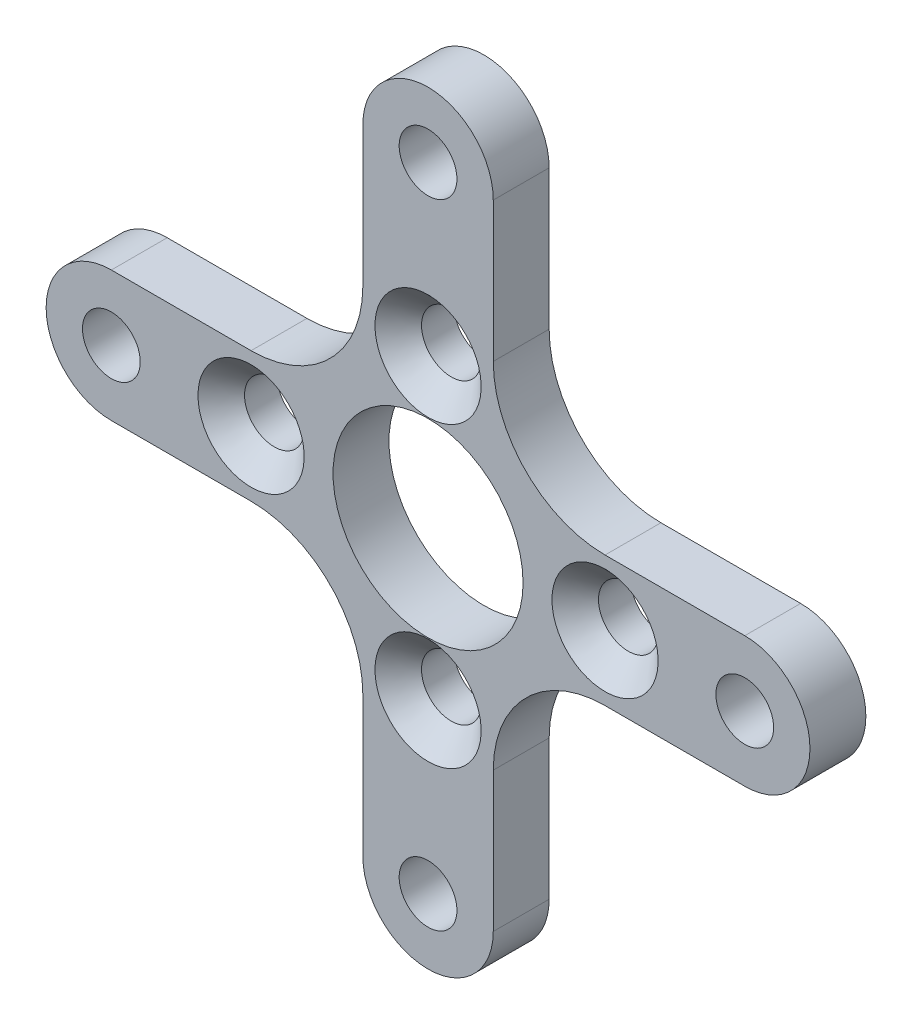
ISO-10303-21;
HEADER;
FILE_DESCRIPTION(('STEP AP214'),'2;1');
FILE_NAME('part.step','',(''),(''),'','','');
FILE_SCHEMA(('AUTOMOTIVE_DESIGN { 1 0 10303 214 1 1 1 1 }'));
ENDSEC;
DATA;
#1=APPLICATION_CONTEXT('core data for automotive mechanical design processes');
#2=APPLICATION_PROTOCOL_DEFINITION('international standard','automotive_design',2000,#1);
#3=PRODUCT_CONTEXT('',#1,'mechanical');
#4=PRODUCT('Part','Part','',(#3));
#5=PRODUCT_RELATED_PRODUCT_CATEGORY('part','',(#4));
#6=PRODUCT_DEFINITION_FORMATION('','',#4);
#7=PRODUCT_DEFINITION_CONTEXT('part definition',#1,'design');
#8=PRODUCT_DEFINITION('design','',#6,#7);
#9=PRODUCT_DEFINITION_SHAPE('','',#8);
#10=(LENGTH_UNIT() NAMED_UNIT(*) SI_UNIT(.MILLI.,.METRE.));
#11=(NAMED_UNIT(*) PLANE_ANGLE_UNIT() SI_UNIT($,.RADIAN.));
#12=(NAMED_UNIT(*) SI_UNIT($,.STERADIAN.) SOLID_ANGLE_UNIT());
#13=UNCERTAINTY_MEASURE_WITH_UNIT(LENGTH_MEASURE(1.E-05),#10,'distance_accuracy_value','');
#14=(GEOMETRIC_REPRESENTATION_CONTEXT(3) GLOBAL_UNCERTAINTY_ASSIGNED_CONTEXT((#13)) GLOBAL_UNIT_ASSIGNED_CONTEXT((#10,
#11,#12)) REPRESENTATION_CONTEXT('',''));
#15=CARTESIAN_POINT('',(0.,0.,0.));
#16=DIRECTION('',(0.,0.,1.));
#17=DIRECTION('',(1.,0.,0.));
#18=AXIS2_PLACEMENT_3D('',#15,#16,#17);
#19=CARTESIAN_POINT('',(-17.,0.,3.));
#20=DIRECTION('',(0.,0.,-1.));
#21=DIRECTION('',(-1.,0.,0.));
#22=AXIS2_PLACEMENT_3D('',#19,#20,#21);
#23=PLANE('',#22);
#24=CARTESIAN_POINT('',(9.5,0.,3.));
#25=DIRECTION('',(0.,0.,-1.));
#26=DIRECTION('',(-1.,0.,0.));
#27=AXIS2_PLACEMENT_3D('',#24,#25,#26);
#28=CIRCLE('',#27,2.85000000000002);
#29=CARTESIAN_POINT('',(6.64999999999998,0.,3.));
#30=VERTEX_POINT('',#29);
#31=EDGE_CURVE('E315',#30,#30,#28,.T.);
#32=ORIENTED_EDGE('',*,*,#31,.T.);
#33=EDGE_LOOP('',(#32));
#34=FACE_BOUND('',#33,.T.);
#35=CARTESIAN_POINT('',(0.,8.,3.));
#36=DIRECTION('',(0.,0.,-1.));
#37=DIRECTION('',(-1.,0.,0.));
#38=AXIS2_PLACEMENT_3D('',#35,#36,#37);
#39=CIRCLE('',#38,2.85000000000002);
#40=CARTESIAN_POINT('',(-2.85000000000002,8.,3.));
#41=VERTEX_POINT('',#40);
#42=EDGE_CURVE('E311',#41,#41,#39,.T.);
#43=ORIENTED_EDGE('',*,*,#42,.T.);
#44=EDGE_LOOP('',(#43));
#45=FACE_BOUND('',#44,.T.);
#46=CARTESIAN_POINT('',(-9.5,0.,3.));
#47=DIRECTION('',(0.,0.,-1.));
#48=DIRECTION('',(-1.,0.,0.));
#49=AXIS2_PLACEMENT_3D('',#46,#47,#48);
#50=CIRCLE('',#49,2.85000000000002);
#51=CARTESIAN_POINT('',(-12.35,0.,3.));
#52=VERTEX_POINT('',#51);
#53=EDGE_CURVE('E307',#52,#52,#50,.T.);
#54=ORIENTED_EDGE('',*,*,#53,.T.);
#55=EDGE_LOOP('',(#54));
#56=FACE_BOUND('',#55,.T.);
#57=CARTESIAN_POINT('',(0.,-8.,3.));
#58=DIRECTION('',(0.,0.,-1.));
#59=DIRECTION('',(-1.,0.,0.));
#60=AXIS2_PLACEMENT_3D('',#57,#58,#59);
#61=CIRCLE('',#60,2.85000000000002);
#62=CARTESIAN_POINT('',(-2.85000000000002,-8.,3.));
#63=VERTEX_POINT('',#62);
#64=EDGE_CURVE('E303',#63,#63,#61,.T.);
#65=ORIENTED_EDGE('',*,*,#64,.T.);
#66=EDGE_LOOP('',(#65));
#67=FACE_BOUND('',#66,.T.);
#68=CARTESIAN_POINT('',(-17.,0.,3.));
#69=DIRECTION('',(0.,0.,1.));
#70=DIRECTION('',(-1.,0.,0.));
#71=AXIS2_PLACEMENT_3D('',#68,#69,#70);
#72=CIRCLE('',#71,3.5);
#73=CARTESIAN_POINT('',(-17.,3.5,3.));
#74=VERTEX_POINT('',#73);
#75=CARTESIAN_POINT('',(-17.,-3.5,3.));
#76=VERTEX_POINT('',#75);
#77=EDGE_CURVE('E245',#74,#76,#72,.T.);
#78=ORIENTED_EDGE('',*,*,#77,.T.);
#79=DIRECTION('',(1.,0.,0.));
#80=VECTOR('',#79,1.);
#81=CARTESIAN_POINT('',(-17.,-3.5,3.));
#82=LINE('',#81,#80);
#83=CARTESIAN_POINT('',(-9.50000000000004,-3.5,3.));
#84=VERTEX_POINT('',#83);
#85=EDGE_CURVE('E133',#76,#84,#82,.T.);
#86=ORIENTED_EDGE('',*,*,#85,.T.);
#87=CARTESIAN_POINT('',(-9.5,-9.5,3.));
#88=DIRECTION('',(0.,0.,-1.));
#89=DIRECTION('',(-1.,0.,0.));
#90=AXIS2_PLACEMENT_3D('',#87,#88,#89);
#91=CIRCLE('',#90,6.);
#92=CARTESIAN_POINT('',(-3.5,-9.50000000000004,3.));
#93=VERTEX_POINT('',#92);
#94=EDGE_CURVE('E481',#84,#93,#91,.T.);
#95=ORIENTED_EDGE('',*,*,#94,.T.);
#96=DIRECTION('',(0.,-1.,0.));
#97=VECTOR('',#96,1.);
#98=CARTESIAN_POINT('',(-3.5,-17.,3.));
#99=LINE('',#98,#97);
#100=CARTESIAN_POINT('',(-3.5,-17.,3.));
#101=VERTEX_POINT('',#100);
#102=EDGE_CURVE('E484',#93,#101,#99,.T.);
#103=ORIENTED_EDGE('',*,*,#102,.T.);
#104=CARTESIAN_POINT('',(0.,-17.,3.));
#105=DIRECTION('',(0.,0.,1.));
#106=DIRECTION('',(-1.,0.,0.));
#107=AXIS2_PLACEMENT_3D('',#104,#105,#106);
#108=CIRCLE('',#107,3.5);
#109=CARTESIAN_POINT('',(3.5,-17.,3.));
#110=VERTEX_POINT('',#109);
#111=EDGE_CURVE('E487',#101,#110,#108,.T.);
#112=ORIENTED_EDGE('',*,*,#111,.T.);
#113=DIRECTION('',(0.,1.,0.));
#114=VECTOR('',#113,1.);
#115=CARTESIAN_POINT('',(3.5,-17.,3.));
#116=LINE('',#115,#114);
#117=CARTESIAN_POINT('',(3.5,-9.50000000000004,3.));
#118=VERTEX_POINT('',#117);
#119=EDGE_CURVE('E490',#110,#118,#116,.T.);
#120=ORIENTED_EDGE('',*,*,#119,.T.);
#121=CARTESIAN_POINT('',(9.5,-9.5,3.));
#122=DIRECTION('',(0.,0.,-1.));
#123=DIRECTION('',(1.,0.,0.));
#124=AXIS2_PLACEMENT_3D('',#121,#122,#123);
#125=CIRCLE('',#124,6.);
#126=CARTESIAN_POINT('',(9.50000000000004,-3.5,3.));
#127=VERTEX_POINT('',#126);
#128=EDGE_CURVE('E493',#118,#127,#125,.T.);
#129=ORIENTED_EDGE('',*,*,#128,.T.);
#130=DIRECTION('',(1.,0.,0.));
#131=VECTOR('',#130,1.);
#132=CARTESIAN_POINT('',(9.50000000000004,-3.5,3.));
#133=LINE('',#132,#131);
#134=CARTESIAN_POINT('',(17.,-3.5,3.));
#135=VERTEX_POINT('',#134);
#136=EDGE_CURVE('E496',#127,#135,#133,.T.);
#137=ORIENTED_EDGE('',*,*,#136,.T.);
#138=CARTESIAN_POINT('',(17.,0.,3.));
#139=DIRECTION('',(0.,0.,1.));
#140=DIRECTION('',(-1.,0.,0.));
#141=AXIS2_PLACEMENT_3D('',#138,#139,#140);
#142=CIRCLE('',#141,3.5);
#143=CARTESIAN_POINT('',(17.,3.5,3.));
#144=VERTEX_POINT('',#143);
#145=EDGE_CURVE('E499',#135,#144,#142,.T.);
#146=ORIENTED_EDGE('',*,*,#145,.T.);
#147=DIRECTION('',(-1.,0.,0.));
#148=VECTOR('',#147,1.);
#149=CARTESIAN_POINT('',(17.,3.5,3.));
#150=LINE('',#149,#148);
#151=CARTESIAN_POINT('',(9.50000000000004,3.5,3.));
#152=VERTEX_POINT('',#151);
#153=EDGE_CURVE('E502',#144,#152,#150,.T.);
#154=ORIENTED_EDGE('',*,*,#153,.T.);
#155=CARTESIAN_POINT('',(9.5,9.5,3.));
#156=DIRECTION('',(0.,0.,-1.));
#157=DIRECTION('',(-1.,0.,0.));
#158=AXIS2_PLACEMENT_3D('',#155,#156,#157);
#159=CIRCLE('',#158,6.);
#160=CARTESIAN_POINT('',(3.5,9.5,3.));
#161=VERTEX_POINT('',#160);
#162=EDGE_CURVE('E505',#152,#161,#159,.T.);
#163=ORIENTED_EDGE('',*,*,#162,.T.);
#164=DIRECTION('',(0.,1.,0.));
#165=VECTOR('',#164,1.);
#166=CARTESIAN_POINT('',(3.5,9.50000000000004,3.));
#167=LINE('',#166,#165);
#168=CARTESIAN_POINT('',(3.5,17.,3.));
#169=VERTEX_POINT('',#168);
#170=EDGE_CURVE('E508',#161,#169,#167,.T.);
#171=ORIENTED_EDGE('',*,*,#170,.T.);
#172=CARTESIAN_POINT('',(0.,17.,3.));
#173=DIRECTION('',(0.,0.,1.));
#174=DIRECTION('',(-1.,0.,0.));
#175=AXIS2_PLACEMENT_3D('',#172,#173,#174);
#176=CIRCLE('',#175,3.5);
#177=CARTESIAN_POINT('',(-3.50000000000001,17.,3.));
#178=VERTEX_POINT('',#177);
#179=EDGE_CURVE('E176',#169,#178,#176,.T.);
#180=ORIENTED_EDGE('',*,*,#179,.T.);
#181=DIRECTION('',(0.,-1.,0.));
#182=VECTOR('',#181,1.);
#183=CARTESIAN_POINT('',(-3.5,17.,3.));
#184=LINE('',#183,#182);
#185=CARTESIAN_POINT('',(-3.5,9.50000000000004,3.));
#186=VERTEX_POINT('',#185);
#187=EDGE_CURVE('E170',#178,#186,#184,.T.);
#188=ORIENTED_EDGE('',*,*,#187,.T.);
#189=CARTESIAN_POINT('',(-9.5,9.5,3.));
#190=DIRECTION('',(0.,0.,-1.));
#191=DIRECTION('',(1.,0.,0.));
#192=AXIS2_PLACEMENT_3D('',#189,#190,#191);
#193=CIRCLE('',#192,6.);
#194=CARTESIAN_POINT('',(-9.50000000000004,3.5,3.));
#195=VERTEX_POINT('',#194);
#196=EDGE_CURVE('E174',#186,#195,#193,.T.);
#197=ORIENTED_EDGE('',*,*,#196,.T.);
#198=DIRECTION('',(-1.,0.,0.));
#199=VECTOR('',#198,1.);
#200=CARTESIAN_POINT('',(-17.,3.5,3.));
#201=LINE('',#200,#199);
#202=EDGE_CURVE('E65',#195,#74,#201,.T.);
#203=ORIENTED_EDGE('',*,*,#202,.T.);
#204=EDGE_LOOP('',(#78,#86,#95,#103,#112,#120,#129,#137,#146,#154,#163,#171,#180,#188,#197,#203));
#205=FACE_BOUND('',#204,.T.);
#206=CARTESIAN_POINT('',(0.,0.,3.));
#207=DIRECTION('',(0.,0.,1.));
#208=DIRECTION('',(1.,0.,0.));
#209=AXIS2_PLACEMENT_3D('',#206,#207,#208);
#210=CIRCLE('',#209,5.1);
#211=CARTESIAN_POINT('',(5.1,0.,3.));
#212=VERTEX_POINT('',#211);
#213=EDGE_CURVE('E203',#212,#212,#210,.T.);
#214=ORIENTED_EDGE('',*,*,#213,.F.);
#215=EDGE_LOOP('',(#214));
#216=FACE_BOUND('',#215,.T.);
#217=CARTESIAN_POINT('',(-17.,0.,3.));
#218=DIRECTION('',(0.,0.,1.));
#219=DIRECTION('',(1.,0.,0.));
#220=AXIS2_PLACEMENT_3D('',#217,#218,#219);
#221=CIRCLE('',#220,1.55);
#222=CARTESIAN_POINT('',(-15.45,0.,3.));
#223=VERTEX_POINT('',#222);
#224=EDGE_CURVE('E451',#223,#223,#221,.T.);
#225=ORIENTED_EDGE('',*,*,#224,.F.);
#226=EDGE_LOOP('',(#225));
#227=FACE_BOUND('',#226,.T.);
#228=CARTESIAN_POINT('',(0.,17.,3.));
#229=DIRECTION('',(0.,0.,1.));
#230=DIRECTION('',(1.,0.,0.));
#231=AXIS2_PLACEMENT_3D('',#228,#229,#230);
#232=CIRCLE('',#231,1.55);
#233=CARTESIAN_POINT('',(1.54999999999999,17.,3.));
#234=VERTEX_POINT('',#233);
#235=EDGE_CURVE('E574',#234,#234,#232,.T.);
#236=ORIENTED_EDGE('',*,*,#235,.F.);
#237=EDGE_LOOP('',(#236));
#238=FACE_BOUND('',#237,.T.);
#239=CARTESIAN_POINT('',(0.,-17.,3.));
#240=DIRECTION('',(0.,0.,1.));
#241=DIRECTION('',(1.,0.,0.));
#242=AXIS2_PLACEMENT_3D('',#239,#240,#241);
#243=CIRCLE('',#242,1.55);
#244=CARTESIAN_POINT('',(1.55,-17.,3.));
#245=VERTEX_POINT('',#244);
#246=EDGE_CURVE('E567',#245,#245,#243,.T.);
#247=ORIENTED_EDGE('',*,*,#246,.F.);
#248=EDGE_LOOP('',(#247));
#249=FACE_BOUND('',#248,.T.);
#250=CARTESIAN_POINT('',(17.,0.,3.));
#251=DIRECTION('',(0.,0.,1.));
#252=DIRECTION('',(1.,0.,0.));
#253=AXIS2_PLACEMENT_3D('',#250,#251,#252);
#254=CIRCLE('',#253,1.55);
#255=CARTESIAN_POINT('',(18.55,0.,3.));
#256=VERTEX_POINT('',#255);
#257=EDGE_CURVE('E560',#256,#256,#254,.T.);
#258=ORIENTED_EDGE('',*,*,#257,.F.);
#259=EDGE_LOOP('',(#258));
#260=FACE_BOUND('',#259,.T.);
#261=ADVANCED_FACE('F46',(#34,#45,#56,#67,#205,#216,#227,#238,#249,#260),#23,.F.);
#262=CARTESIAN_POINT('',(-17.,0.,0.));
#263=DIRECTION('',(0.,0.,-1.));
#264=DIRECTION('',(-1.,0.,0.));
#265=AXIS2_PLACEMENT_3D('',#262,#263,#264);
#266=PLANE('',#265);
#267=CARTESIAN_POINT('',(0.,-17.,0.));
#268=DIRECTION('',(0.,0.,1.));
#269=DIRECTION('',(1.,0.,0.));
#270=AXIS2_PLACEMENT_3D('',#267,#268,#269);
#271=CIRCLE('',#270,1.55);
#272=CARTESIAN_POINT('',(1.55,-17.,0.));
#273=VERTEX_POINT('',#272);
#274=EDGE_CURVE('E564',#273,#273,#271,.T.);
#275=ORIENTED_EDGE('',*,*,#274,.T.);
#276=EDGE_LOOP('',(#275));
#277=FACE_BOUND('',#276,.T.);
#278=CARTESIAN_POINT('',(-17.,0.,0.));
#279=DIRECTION('',(0.,0.,1.));
#280=DIRECTION('',(1.,0.,0.));
#281=AXIS2_PLACEMENT_3D('',#278,#279,#280);
#282=CIRCLE('',#281,1.55);
#283=CARTESIAN_POINT('',(-15.45,0.,0.));
#284=VERTEX_POINT('',#283);
#285=EDGE_CURVE('E459',#284,#284,#282,.T.);
#286=ORIENTED_EDGE('',*,*,#285,.T.);
#287=EDGE_LOOP('',(#286));
#288=FACE_BOUND('',#287,.T.);
#289=CARTESIAN_POINT('',(0.,-8.,0.));
#290=DIRECTION('',(0.,0.,1.));
#291=DIRECTION('',(1.,0.,0.));
#292=AXIS2_PLACEMENT_3D('',#289,#290,#291);
#293=CIRCLE('',#292,1.6);
#294=CARTESIAN_POINT('',(1.6,-8.,0.));
#295=VERTEX_POINT('',#294);
#296=EDGE_CURVE('E450',#295,#295,#293,.T.);
#297=ORIENTED_EDGE('',*,*,#296,.T.);
#298=EDGE_LOOP('',(#297));
#299=FACE_BOUND('',#298,.T.);
#300=CARTESIAN_POINT('',(-9.5,0.,0.));
#301=DIRECTION('',(0.,0.,1.));
#302=DIRECTION('',(1.,0.,0.));
#303=AXIS2_PLACEMENT_3D('',#300,#301,#302);
#304=CIRCLE('',#303,1.6);
#305=CARTESIAN_POINT('',(-7.9,0.,0.));
#306=VERTEX_POINT('',#305);
#307=EDGE_CURVE('E466',#306,#306,#304,.T.);
#308=ORIENTED_EDGE('',*,*,#307,.T.);
#309=EDGE_LOOP('',(#308));
#310=FACE_BOUND('',#309,.T.);
#311=CARTESIAN_POINT('',(-17.,0.,0.));
#312=DIRECTION('',(0.,0.,1.));
#313=DIRECTION('',(-1.,0.,0.));
#314=AXIS2_PLACEMENT_3D('',#311,#312,#313);
#315=CIRCLE('',#314,3.5);
#316=CARTESIAN_POINT('',(-17.,3.5,0.));
#317=VERTEX_POINT('',#316);
#318=CARTESIAN_POINT('',(-17.,-3.5,0.));
#319=VERTEX_POINT('',#318);
#320=EDGE_CURVE('E198',#317,#319,#315,.T.);
#321=ORIENTED_EDGE('',*,*,#320,.F.);
#322=DIRECTION('',(-1.,0.,0.));
#323=VECTOR('',#322,1.);
#324=CARTESIAN_POINT('',(-17.,3.5,0.));
#325=LINE('',#324,#323);
#326=CARTESIAN_POINT('',(-9.50000000000004,3.5,0.));
#327=VERTEX_POINT('',#326);
#328=EDGE_CURVE('E124',#327,#317,#325,.T.);
#329=ORIENTED_EDGE('',*,*,#328,.F.);
#330=CARTESIAN_POINT('',(-9.5,9.5,0.));
#331=DIRECTION('',(0.,0.,-1.));
#332=DIRECTION('',(1.,0.,0.));
#333=AXIS2_PLACEMENT_3D('',#330,#331,#332);
#334=CIRCLE('',#333,6.);
#335=CARTESIAN_POINT('',(-3.5,9.50000000000004,0.));
#336=VERTEX_POINT('',#335);
#337=EDGE_CURVE('E118',#336,#327,#334,.T.);
#338=ORIENTED_EDGE('',*,*,#337,.F.);
#339=DIRECTION('',(0.,-1.,0.));
#340=VECTOR('',#339,1.);
#341=CARTESIAN_POINT('',(-3.5,17.,0.));
#342=LINE('',#341,#340);
#343=CARTESIAN_POINT('',(-3.50000000000001,17.,0.));
#344=VERTEX_POINT('',#343);
#345=EDGE_CURVE('E185',#344,#336,#342,.T.);
#346=ORIENTED_EDGE('',*,*,#345,.F.);
#347=CARTESIAN_POINT('',(0.,17.,0.));
#348=DIRECTION('',(0.,0.,1.));
#349=DIRECTION('',(-1.,0.,0.));
#350=AXIS2_PLACEMENT_3D('',#347,#348,#349);
#351=CIRCLE('',#350,3.5);
#352=CARTESIAN_POINT('',(3.5,17.,0.));
#353=VERTEX_POINT('',#352);
#354=EDGE_CURVE('E236',#353,#344,#351,.T.);
#355=ORIENTED_EDGE('',*,*,#354,.F.);
#356=DIRECTION('',(0.,1.,0.));
#357=VECTOR('',#356,1.);
#358=CARTESIAN_POINT('',(3.5,9.50000000000004,0.));
#359=LINE('',#358,#357);
#360=CARTESIAN_POINT('',(3.5,9.5,0.));
#361=VERTEX_POINT('',#360);
#362=EDGE_CURVE('E233',#361,#353,#359,.T.);
#363=ORIENTED_EDGE('',*,*,#362,.F.);
#364=CARTESIAN_POINT('',(9.5,9.5,0.));
#365=DIRECTION('',(0.,0.,-1.));
#366=DIRECTION('',(-1.,0.,0.));
#367=AXIS2_PLACEMENT_3D('',#364,#365,#366);
#368=CIRCLE('',#367,6.);
#369=CARTESIAN_POINT('',(9.50000000000004,3.5,0.));
#370=VERTEX_POINT('',#369);
#371=EDGE_CURVE('E230',#370,#361,#368,.T.);
#372=ORIENTED_EDGE('',*,*,#371,.F.);
#373=DIRECTION('',(-1.,0.,0.));
#374=VECTOR('',#373,1.);
#375=CARTESIAN_POINT('',(17.,3.5,0.));
#376=LINE('',#375,#374);
#377=CARTESIAN_POINT('',(17.,3.5,0.));
#378=VERTEX_POINT('',#377);
#379=EDGE_CURVE('E227',#378,#370,#376,.T.);
#380=ORIENTED_EDGE('',*,*,#379,.F.);
#381=CARTESIAN_POINT('',(17.,0.,0.));
#382=DIRECTION('',(0.,0.,1.));
#383=DIRECTION('',(-1.,0.,0.));
#384=AXIS2_PLACEMENT_3D('',#381,#382,#383);
#385=CIRCLE('',#384,3.5);
#386=CARTESIAN_POINT('',(17.,-3.5,0.));
#387=VERTEX_POINT('',#386);
#388=EDGE_CURVE('E224',#387,#378,#385,.T.);
#389=ORIENTED_EDGE('',*,*,#388,.F.);
#390=DIRECTION('',(1.,0.,0.));
#391=VECTOR('',#390,1.);
#392=CARTESIAN_POINT('',(9.50000000000004,-3.5,0.));
#393=LINE('',#392,#391);
#394=CARTESIAN_POINT('',(9.50000000000004,-3.5,0.));
#395=VERTEX_POINT('',#394);
#396=EDGE_CURVE('E221',#395,#387,#393,.T.);
#397=ORIENTED_EDGE('',*,*,#396,.F.);
#398=CARTESIAN_POINT('',(9.5,-9.5,0.));
#399=DIRECTION('',(0.,0.,-1.));
#400=DIRECTION('',(1.,0.,0.));
#401=AXIS2_PLACEMENT_3D('',#398,#399,#400);
#402=CIRCLE('',#401,6.);
#403=CARTESIAN_POINT('',(3.5,-9.50000000000004,0.));
#404=VERTEX_POINT('',#403);
#405=EDGE_CURVE('E218',#404,#395,#402,.T.);
#406=ORIENTED_EDGE('',*,*,#405,.F.);
#407=DIRECTION('',(0.,1.,0.));
#408=VECTOR('',#407,1.);
#409=CARTESIAN_POINT('',(3.5,-17.,0.));
#410=LINE('',#409,#408);
#411=CARTESIAN_POINT('',(3.5,-17.,0.));
#412=VERTEX_POINT('',#411);
#413=EDGE_CURVE('E215',#412,#404,#410,.T.);
#414=ORIENTED_EDGE('',*,*,#413,.F.);
#415=CARTESIAN_POINT('',(0.,-17.,0.));
#416=DIRECTION('',(0.,0.,1.));
#417=DIRECTION('',(-1.,0.,0.));
#418=AXIS2_PLACEMENT_3D('',#415,#416,#417);
#419=CIRCLE('',#418,3.5);
#420=CARTESIAN_POINT('',(-3.5,-17.,0.));
#421=VERTEX_POINT('',#420);
#422=EDGE_CURVE('E212',#421,#412,#419,.T.);
#423=ORIENTED_EDGE('',*,*,#422,.F.);
#424=DIRECTION('',(0.,-1.,0.));
#425=VECTOR('',#424,1.);
#426=CARTESIAN_POINT('',(-3.5,-17.,0.));
#427=LINE('',#426,#425);
#428=CARTESIAN_POINT('',(-3.5,-9.50000000000004,0.));
#429=VERTEX_POINT('',#428);
#430=EDGE_CURVE('E209',#429,#421,#427,.T.);
#431=ORIENTED_EDGE('',*,*,#430,.F.);
#432=CARTESIAN_POINT('',(-9.5,-9.5,0.));
#433=DIRECTION('',(0.,0.,-1.));
#434=DIRECTION('',(-1.,0.,0.));
#435=AXIS2_PLACEMENT_3D('',#432,#433,#434);
#436=CIRCLE('',#435,6.);
#437=CARTESIAN_POINT('',(-9.50000000000004,-3.5,0.));
#438=VERTEX_POINT('',#437);
#439=EDGE_CURVE('E206',#438,#429,#436,.T.);
#440=ORIENTED_EDGE('',*,*,#439,.F.);
#441=DIRECTION('',(1.,0.,0.));
#442=VECTOR('',#441,1.);
#443=CARTESIAN_POINT('',(-17.,-3.5,0.));
#444=LINE('',#443,#442);
#445=EDGE_CURVE('E202',#319,#438,#444,.T.);
#446=ORIENTED_EDGE('',*,*,#445,.F.);
#447=EDGE_LOOP('',(#321,#329,#338,#346,#355,#363,#372,#380,#389,#397,#406,#414,#423,#431,#440,#446));
#448=FACE_BOUND('',#447,.T.);
#449=CARTESIAN_POINT('',(0.,0.,0.));
#450=DIRECTION('',(0.,0.,1.));
#451=DIRECTION('',(1.,0.,0.));
#452=AXIS2_PLACEMENT_3D('',#449,#450,#451);
#453=CIRCLE('',#452,5.1);
#454=CARTESIAN_POINT('',(5.1,0.,0.));
#455=VERTEX_POINT('',#454);
#456=EDGE_CURVE('E470',#455,#455,#453,.T.);
#457=ORIENTED_EDGE('',*,*,#456,.T.);
#458=EDGE_LOOP('',(#457));
#459=FACE_BOUND('',#458,.T.);
#460=CARTESIAN_POINT('',(0.,8.,0.));
#461=DIRECTION('',(0.,0.,1.));
#462=DIRECTION('',(1.,0.,0.));
#463=AXIS2_PLACEMENT_3D('',#460,#461,#462);
#464=CIRCLE('',#463,1.6);
#465=CARTESIAN_POINT('',(1.6,8.,0.));
#466=VERTEX_POINT('',#465);
#467=EDGE_CURVE('E456',#466,#466,#464,.T.);
#468=ORIENTED_EDGE('',*,*,#467,.T.);
#469=EDGE_LOOP('',(#468));
#470=FACE_BOUND('',#469,.T.);
#471=CARTESIAN_POINT('',(9.5,0.,0.));
#472=DIRECTION('',(0.,0.,1.));
#473=DIRECTION('',(1.,0.,0.));
#474=AXIS2_PLACEMENT_3D('',#471,#472,#473);
#475=CIRCLE('',#474,1.6);
#476=CARTESIAN_POINT('',(11.1,0.,0.));
#477=VERTEX_POINT('',#476);
#478=EDGE_CURVE('E447',#477,#477,#475,.T.);
#479=ORIENTED_EDGE('',*,*,#478,.T.);
#480=EDGE_LOOP('',(#479));
#481=FACE_BOUND('',#480,.T.);
#482=CARTESIAN_POINT('',(0.,17.,0.));
#483=DIRECTION('',(0.,0.,1.));
#484=DIRECTION('',(1.,0.,0.));
#485=AXIS2_PLACEMENT_3D('',#482,#483,#484);
#486=CIRCLE('',#485,1.55);
#487=CARTESIAN_POINT('',(1.54999999999999,17.,0.));
#488=VERTEX_POINT('',#487);
#489=EDGE_CURVE('E554',#488,#488,#486,.T.);
#490=ORIENTED_EDGE('',*,*,#489,.T.);
#491=EDGE_LOOP('',(#490));
#492=FACE_BOUND('',#491,.T.);
#493=CARTESIAN_POINT('',(17.,0.,0.));
#494=DIRECTION('',(0.,0.,1.));
#495=DIRECTION('',(1.,0.,0.));
#496=AXIS2_PLACEMENT_3D('',#493,#494,#495);
#497=CIRCLE('',#496,1.55);
#498=CARTESIAN_POINT('',(18.55,0.,0.));
#499=VERTEX_POINT('',#498);
#500=EDGE_CURVE('E557',#499,#499,#497,.T.);
#501=ORIENTED_EDGE('',*,*,#500,.T.);
#502=EDGE_LOOP('',(#501));
#503=FACE_BOUND('',#502,.T.);
#504=ADVANCED_FACE('F344',(#277,#288,#299,#310,#448,#459,#470,#481,#492,#503),#266,.T.);
#505=CARTESIAN_POINT('',(-17.,0.,3.));
#506=DIRECTION('',(0.,0.,-1.));
#507=DIRECTION('',(-1.,0.,0.));
#508=AXIS2_PLACEMENT_3D('',#505,#506,#507);
#509=CYLINDRICAL_SURFACE('',#508,3.5);
#510=ORIENTED_EDGE('',*,*,#320,.T.);
#511=DIRECTION('',(0.,0.,-1.));
#512=VECTOR('',#511,1.);
#513=CARTESIAN_POINT('',(-17.,-3.5,3.));
#514=LINE('',#513,#512);
#515=EDGE_CURVE('E296',#76,#319,#514,.T.);
#516=ORIENTED_EDGE('',*,*,#515,.F.);
#517=ORIENTED_EDGE('',*,*,#77,.F.);
#518=DIRECTION('',(0.,0.,-1.));
#519=VECTOR('',#518,1.);
#520=CARTESIAN_POINT('',(-17.,3.5,3.));
#521=LINE('',#520,#519);
#522=EDGE_CURVE('E194',#74,#317,#521,.T.);
#523=ORIENTED_EDGE('',*,*,#522,.T.);
#524=EDGE_LOOP('',(#510,#516,#517,#523));
#525=FACE_BOUND('',#524,.T.);
#526=ADVANCED_FACE('F352',(#525),#509,.T.);
#527=CARTESIAN_POINT('',(-17.,-3.5,3.));
#528=DIRECTION('',(0.,1.,0.));
#529=DIRECTION('',(0.,0.,1.));
#530=AXIS2_PLACEMENT_3D('',#527,#528,#529);
#531=PLANE('',#530);
#532=ORIENTED_EDGE('',*,*,#445,.T.);
#533=DIRECTION('',(0.,0.,-1.));
#534=VECTOR('',#533,1.);
#535=CARTESIAN_POINT('',(-9.50000000000004,-3.5,3.));
#536=LINE('',#535,#534);
#537=EDGE_CURVE('E292',#84,#438,#536,.T.);
#538=ORIENTED_EDGE('',*,*,#537,.F.);
#539=ORIENTED_EDGE('',*,*,#85,.F.);
#540=ORIENTED_EDGE('',*,*,#515,.T.);
#541=EDGE_LOOP('',(#532,#538,#539,#540));
#542=FACE_BOUND('',#541,.T.);
#543=ADVANCED_FACE('F410',(#542),#531,.F.);
#544=CARTESIAN_POINT('',(-9.5,-9.5,3.));
#545=DIRECTION('',(0.,0.,-1.));
#546=DIRECTION('',(-1.,0.,0.));
#547=AXIS2_PLACEMENT_3D('',#544,#545,#546);
#548=CYLINDRICAL_SURFACE('',#547,6.);
#549=ORIENTED_EDGE('',*,*,#439,.T.);
#550=DIRECTION('',(0.,0.,-1.));
#551=VECTOR('',#550,1.);
#552=CARTESIAN_POINT('',(-3.5,-9.50000000000004,3.));
#553=LINE('',#552,#551);
#554=EDGE_CURVE('E288',#93,#429,#553,.T.);
#555=ORIENTED_EDGE('',*,*,#554,.F.);
#556=ORIENTED_EDGE('',*,*,#94,.F.);
#557=ORIENTED_EDGE('',*,*,#537,.T.);
#558=EDGE_LOOP('',(#549,#555,#556,#557));
#559=FACE_BOUND('',#558,.T.);
#560=ADVANCED_FACE('F406',(#559),#548,.F.);
#561=CARTESIAN_POINT('',(-3.5,-17.,3.));
#562=DIRECTION('',(1.,0.,0.));
#563=DIRECTION('',(0.,0.,-1.));
#564=AXIS2_PLACEMENT_3D('',#561,#562,#563);
#565=PLANE('',#564);
#566=ORIENTED_EDGE('',*,*,#430,.T.);
#567=DIRECTION('',(0.,0.,-1.));
#568=VECTOR('',#567,1.);
#569=CARTESIAN_POINT('',(-3.5,-17.,3.));
#570=LINE('',#569,#568);
#571=EDGE_CURVE('E284',#101,#421,#570,.T.);
#572=ORIENTED_EDGE('',*,*,#571,.F.);
#573=ORIENTED_EDGE('',*,*,#102,.F.);
#574=ORIENTED_EDGE('',*,*,#554,.T.);
#575=EDGE_LOOP('',(#566,#572,#573,#574));
#576=FACE_BOUND('',#575,.T.);
#577=ADVANCED_FACE('F402',(#576),#565,.F.);
#578=CARTESIAN_POINT('',(0.,-17.,3.));
#579=DIRECTION('',(0.,0.,-1.));
#580=DIRECTION('',(-1.,0.,0.));
#581=AXIS2_PLACEMENT_3D('',#578,#579,#580);
#582=CYLINDRICAL_SURFACE('',#581,3.5);
#583=ORIENTED_EDGE('',*,*,#422,.T.);
#584=DIRECTION('',(0.,0.,-1.));
#585=VECTOR('',#584,1.);
#586=CARTESIAN_POINT('',(3.5,-17.,3.));
#587=LINE('',#586,#585);
#588=EDGE_CURVE('E280',#110,#412,#587,.T.);
#589=ORIENTED_EDGE('',*,*,#588,.F.);
#590=ORIENTED_EDGE('',*,*,#111,.F.);
#591=ORIENTED_EDGE('',*,*,#571,.T.);
#592=EDGE_LOOP('',(#583,#589,#590,#591));
#593=FACE_BOUND('',#592,.T.);
#594=ADVANCED_FACE('F398',(#593),#582,.T.);
#595=CARTESIAN_POINT('',(3.5,-17.,3.));
#596=DIRECTION('',(-1.,0.,0.));
#597=DIRECTION('',(0.,0.,1.));
#598=AXIS2_PLACEMENT_3D('',#595,#596,#597);
#599=PLANE('',#598);
#600=ORIENTED_EDGE('',*,*,#413,.T.);
#601=DIRECTION('',(0.,0.,-1.));
#602=VECTOR('',#601,1.);
#603=CARTESIAN_POINT('',(3.5,-9.50000000000004,3.));
#604=LINE('',#603,#602);
#605=EDGE_CURVE('E276',#118,#404,#604,.T.);
#606=ORIENTED_EDGE('',*,*,#605,.F.);
#607=ORIENTED_EDGE('',*,*,#119,.F.);
#608=ORIENTED_EDGE('',*,*,#588,.T.);
#609=EDGE_LOOP('',(#600,#606,#607,#608));
#610=FACE_BOUND('',#609,.T.);
#611=ADVANCED_FACE('F394',(#610),#599,.F.);
#612=CARTESIAN_POINT('',(9.5,-9.5,3.));
#613=DIRECTION('',(0.,0.,-1.));
#614=DIRECTION('',(-1.,0.,0.));
#615=AXIS2_PLACEMENT_3D('',#612,#613,#614);
#616=CYLINDRICAL_SURFACE('',#615,6.);
#617=ORIENTED_EDGE('',*,*,#405,.T.);
#618=DIRECTION('',(0.,0.,-1.));
#619=VECTOR('',#618,1.);
#620=CARTESIAN_POINT('',(9.50000000000004,-3.5,3.));
#621=LINE('',#620,#619);
#622=EDGE_CURVE('E272',#127,#395,#621,.T.);
#623=ORIENTED_EDGE('',*,*,#622,.F.);
#624=ORIENTED_EDGE('',*,*,#128,.F.);
#625=ORIENTED_EDGE('',*,*,#605,.T.);
#626=EDGE_LOOP('',(#617,#623,#624,#625));
#627=FACE_BOUND('',#626,.T.);
#628=ADVANCED_FACE('F390',(#627),#616,.F.);
#629=CARTESIAN_POINT('',(9.50000000000004,-3.5,3.));
#630=DIRECTION('',(0.,1.,0.));
#631=DIRECTION('',(0.,0.,1.));
#632=AXIS2_PLACEMENT_3D('',#629,#630,#631);
#633=PLANE('',#632);
#634=ORIENTED_EDGE('',*,*,#396,.T.);
#635=DIRECTION('',(0.,0.,-1.));
#636=VECTOR('',#635,1.);
#637=CARTESIAN_POINT('',(17.,-3.5,3.));
#638=LINE('',#637,#636);
#639=EDGE_CURVE('E268',#135,#387,#638,.T.);
#640=ORIENTED_EDGE('',*,*,#639,.F.);
#641=ORIENTED_EDGE('',*,*,#136,.F.);
#642=ORIENTED_EDGE('',*,*,#622,.T.);
#643=EDGE_LOOP('',(#634,#640,#641,#642));
#644=FACE_BOUND('',#643,.T.);
#645=ADVANCED_FACE('F386',(#644),#633,.F.);
#646=CARTESIAN_POINT('',(17.,0.,3.));
#647=DIRECTION('',(0.,0.,-1.));
#648=DIRECTION('',(-1.,0.,0.));
#649=AXIS2_PLACEMENT_3D('',#646,#647,#648);
#650=CYLINDRICAL_SURFACE('',#649,3.5);
#651=ORIENTED_EDGE('',*,*,#388,.T.);
#652=DIRECTION('',(0.,0.,-1.));
#653=VECTOR('',#652,1.);
#654=CARTESIAN_POINT('',(17.,3.5,3.));
#655=LINE('',#654,#653);
#656=EDGE_CURVE('E264',#144,#378,#655,.T.);
#657=ORIENTED_EDGE('',*,*,#656,.F.);
#658=ORIENTED_EDGE('',*,*,#145,.F.);
#659=ORIENTED_EDGE('',*,*,#639,.T.);
#660=EDGE_LOOP('',(#651,#657,#658,#659));
#661=FACE_BOUND('',#660,.T.);
#662=ADVANCED_FACE('F382',(#661),#650,.T.);
#663=CARTESIAN_POINT('',(17.,3.5,3.));
#664=DIRECTION('',(0.,-1.,0.));
#665=DIRECTION('',(0.,0.,-1.));
#666=AXIS2_PLACEMENT_3D('',#663,#664,#665);
#667=PLANE('',#666);
#668=ORIENTED_EDGE('',*,*,#379,.T.);
#669=DIRECTION('',(0.,0.,-1.));
#670=VECTOR('',#669,1.);
#671=CARTESIAN_POINT('',(9.50000000000004,3.5,3.));
#672=LINE('',#671,#670);
#673=EDGE_CURVE('E260',#152,#370,#672,.T.);
#674=ORIENTED_EDGE('',*,*,#673,.F.);
#675=ORIENTED_EDGE('',*,*,#153,.F.);
#676=ORIENTED_EDGE('',*,*,#656,.T.);
#677=EDGE_LOOP('',(#668,#674,#675,#676));
#678=FACE_BOUND('',#677,.T.);
#679=ADVANCED_FACE('F378',(#678),#667,.F.);
#680=CARTESIAN_POINT('',(9.5,9.5,3.));
#681=DIRECTION('',(0.,0.,-1.));
#682=DIRECTION('',(-1.,0.,0.));
#683=AXIS2_PLACEMENT_3D('',#680,#681,#682);
#684=CYLINDRICAL_SURFACE('',#683,6.);
#685=ORIENTED_EDGE('',*,*,#371,.T.);
#686=DIRECTION('',(0.,0.,-1.));
#687=VECTOR('',#686,1.);
#688=CARTESIAN_POINT('',(3.5,9.5,3.));
#689=LINE('',#688,#687);
#690=EDGE_CURVE('E256',#161,#361,#689,.T.);
#691=ORIENTED_EDGE('',*,*,#690,.F.);
#692=ORIENTED_EDGE('',*,*,#162,.F.);
#693=ORIENTED_EDGE('',*,*,#673,.T.);
#694=EDGE_LOOP('',(#685,#691,#692,#693));
#695=FACE_BOUND('',#694,.T.);
#696=ADVANCED_FACE('F374',(#695),#684,.F.);
#697=CARTESIAN_POINT('',(3.5,9.50000000000004,3.));
#698=DIRECTION('',(-1.,0.,0.));
#699=DIRECTION('',(0.,0.,1.));
#700=AXIS2_PLACEMENT_3D('',#697,#698,#699);
#701=PLANE('',#700);
#702=ORIENTED_EDGE('',*,*,#362,.T.);
#703=DIRECTION('',(0.,0.,-1.));
#704=VECTOR('',#703,1.);
#705=CARTESIAN_POINT('',(3.5,17.,3.));
#706=LINE('',#705,#704);
#707=EDGE_CURVE('E252',#169,#353,#706,.T.);
#708=ORIENTED_EDGE('',*,*,#707,.F.);
#709=ORIENTED_EDGE('',*,*,#170,.F.);
#710=ORIENTED_EDGE('',*,*,#690,.T.);
#711=EDGE_LOOP('',(#702,#708,#709,#710));
#712=FACE_BOUND('',#711,.T.);
#713=ADVANCED_FACE('F370',(#712),#701,.F.);
#714=CARTESIAN_POINT('',(0.,17.,3.));
#715=DIRECTION('',(0.,0.,-1.));
#716=DIRECTION('',(-1.,0.,0.));
#717=AXIS2_PLACEMENT_3D('',#714,#715,#716);
#718=CYLINDRICAL_SURFACE('',#717,3.5);
#719=ORIENTED_EDGE('',*,*,#354,.T.);
#720=DIRECTION('',(0.,0.,-1.));
#721=VECTOR('',#720,1.);
#722=CARTESIAN_POINT('',(-3.50000000000001,17.,3.));
#723=LINE('',#722,#721);
#724=EDGE_CURVE('E187',#178,#344,#723,.T.);
#725=ORIENTED_EDGE('',*,*,#724,.F.);
#726=ORIENTED_EDGE('',*,*,#179,.F.);
#727=ORIENTED_EDGE('',*,*,#707,.T.);
#728=EDGE_LOOP('',(#719,#725,#726,#727));
#729=FACE_BOUND('',#728,.T.);
#730=ADVANCED_FACE('F367',(#729),#718,.T.);
#731=CARTESIAN_POINT('',(-3.5,17.,3.));
#732=DIRECTION('',(1.,0.,0.));
#733=DIRECTION('',(0.,0.,-1.));
#734=AXIS2_PLACEMENT_3D('',#731,#732,#733);
#735=PLANE('',#734);
#736=ORIENTED_EDGE('',*,*,#345,.T.);
#737=DIRECTION('',(0.,0.,-1.));
#738=VECTOR('',#737,1.);
#739=CARTESIAN_POINT('',(-3.5,9.50000000000004,3.));
#740=LINE('',#739,#738);
#741=EDGE_CURVE('E182',#186,#336,#740,.T.);
#742=ORIENTED_EDGE('',*,*,#741,.F.);
#743=ORIENTED_EDGE('',*,*,#187,.F.);
#744=ORIENTED_EDGE('',*,*,#724,.T.);
#745=EDGE_LOOP('',(#736,#742,#743,#744));
#746=FACE_BOUND('',#745,.T.);
#747=ADVANCED_FACE('F183',(#746),#735,.F.);
#748=CARTESIAN_POINT('',(-9.5,9.5,3.));
#749=DIRECTION('',(0.,0.,-1.));
#750=DIRECTION('',(-1.,0.,0.));
#751=AXIS2_PLACEMENT_3D('',#748,#749,#750);
#752=CYLINDRICAL_SURFACE('',#751,6.);
#753=ORIENTED_EDGE('',*,*,#337,.T.);
#754=DIRECTION('',(0.,0.,-1.));
#755=VECTOR('',#754,1.);
#756=CARTESIAN_POINT('',(-9.50000000000004,3.5,3.));
#757=LINE('',#756,#755);
#758=EDGE_CURVE('E188',#195,#327,#757,.T.);
#759=ORIENTED_EDGE('',*,*,#758,.F.);
#760=ORIENTED_EDGE('',*,*,#196,.F.);
#761=ORIENTED_EDGE('',*,*,#741,.T.);
#762=EDGE_LOOP('',(#753,#759,#760,#761));
#763=FACE_BOUND('',#762,.T.);
#764=ADVANCED_FACE('F190',(#763),#752,.F.);
#765=CARTESIAN_POINT('',(-17.,3.5,3.));
#766=DIRECTION('',(0.,-1.,0.));
#767=DIRECTION('',(0.,0.,-1.));
#768=AXIS2_PLACEMENT_3D('',#765,#766,#767);
#769=PLANE('',#768);
#770=ORIENTED_EDGE('',*,*,#328,.T.);
#771=ORIENTED_EDGE('',*,*,#522,.F.);
#772=ORIENTED_EDGE('',*,*,#202,.F.);
#773=ORIENTED_EDGE('',*,*,#758,.T.);
#774=EDGE_LOOP('',(#770,#771,#772,#773));
#775=FACE_BOUND('',#774,.T.);
#776=ADVANCED_FACE('F360',(#775),#769,.F.);
#777=CARTESIAN_POINT('',(0.,0.,3.));
#778=DIRECTION('',(0.,0.,-1.));
#779=DIRECTION('',(-1.,0.,0.));
#780=AXIS2_PLACEMENT_3D('',#777,#778,#779);
#781=CYLINDRICAL_SURFACE('',#780,5.1);
#782=ORIENTED_EDGE('',*,*,#213,.T.);
#783=EDGE_LOOP('',(#782));
#784=FACE_BOUND('',#783,.T.);
#785=ORIENTED_EDGE('',*,*,#456,.F.);
#786=EDGE_LOOP('',(#785));
#787=FACE_BOUND('',#786,.T.);
#788=ADVANCED_FACE('F357',(#784,#787),#781,.F.);
#789=CARTESIAN_POINT('',(-9.5,0.,3.));
#790=DIRECTION('',(0.,0.,-1.));
#791=DIRECTION('',(-1.,0.,0.));
#792=AXIS2_PLACEMENT_3D('',#789,#790,#791);
#793=CYLINDRICAL_SURFACE('',#792,1.6);
#794=CARTESIAN_POINT('',(-9.5,0.,1.74999999999999));
#795=DIRECTION('',(0.,0.,-1.));
#796=DIRECTION('',(-1.,0.,0.));
#797=AXIS2_PLACEMENT_3D('',#794,#795,#796);
#798=CIRCLE('',#797,1.6);
#799=CARTESIAN_POINT('',(-11.1,0.,1.74999999999999));
#800=VERTEX_POINT('',#799);
#801=EDGE_CURVE('E57',#800,#800,#798,.F.);
#802=ORIENTED_EDGE('',*,*,#801,.T.);
#803=EDGE_LOOP('',(#802));
#804=FACE_BOUND('',#803,.T.);
#805=ORIENTED_EDGE('',*,*,#307,.F.);
#806=EDGE_LOOP('',(#805));
#807=FACE_BOUND('',#806,.T.);
#808=ADVANCED_FACE('F326',(#804,#807),#793,.F.);
#809=CARTESIAN_POINT('',(0.,8.,3.));
#810=DIRECTION('',(0.,0.,-1.));
#811=DIRECTION('',(-1.,0.,0.));
#812=AXIS2_PLACEMENT_3D('',#809,#810,#811);
#813=CYLINDRICAL_SURFACE('',#812,1.6);
#814=CARTESIAN_POINT('',(0.,8.,1.74999999999999));
#815=DIRECTION('',(0.,0.,-1.));
#816=DIRECTION('',(-1.,0.,0.));
#817=AXIS2_PLACEMENT_3D('',#814,#815,#816);
#818=CIRCLE('',#817,1.6);
#819=CARTESIAN_POINT('',(-1.6,8.,1.74999999999999));
#820=VERTEX_POINT('',#819);
#821=EDGE_CURVE('E319',#820,#820,#818,.F.);
#822=ORIENTED_EDGE('',*,*,#821,.T.);
#823=EDGE_LOOP('',(#822));
#824=FACE_BOUND('',#823,.T.);
#825=ORIENTED_EDGE('',*,*,#467,.F.);
#826=EDGE_LOOP('',(#825));
#827=FACE_BOUND('',#826,.T.);
#828=ADVANCED_FACE('F599',(#824,#827),#813,.F.);
#829=CARTESIAN_POINT('',(0.,-8.,3.));
#830=DIRECTION('',(0.,0.,-1.));
#831=DIRECTION('',(-1.,0.,0.));
#832=AXIS2_PLACEMENT_3D('',#829,#830,#831);
#833=CYLINDRICAL_SURFACE('',#832,1.6);
#834=CARTESIAN_POINT('',(0.,-8.,1.74999999999999));
#835=DIRECTION('',(0.,0.,-1.));
#836=DIRECTION('',(-1.,0.,0.));
#837=AXIS2_PLACEMENT_3D('',#834,#835,#836);
#838=CIRCLE('',#837,1.6);
#839=CARTESIAN_POINT('',(-1.6,-8.,1.74999999999999));
#840=VERTEX_POINT('',#839);
#841=EDGE_CURVE('E11',#840,#840,#838,.F.);
#842=ORIENTED_EDGE('',*,*,#841,.T.);
#843=EDGE_LOOP('',(#842));
#844=FACE_BOUND('',#843,.T.);
#845=ORIENTED_EDGE('',*,*,#296,.F.);
#846=EDGE_LOOP('',(#845));
#847=FACE_BOUND('',#846,.T.);
#848=ADVANCED_FACE('F443',(#844,#847),#833,.F.);
#849=CARTESIAN_POINT('',(9.5,0.,3.));
#850=DIRECTION('',(0.,0.,-1.));
#851=DIRECTION('',(-1.,0.,0.));
#852=AXIS2_PLACEMENT_3D('',#849,#850,#851);
#853=CYLINDRICAL_SURFACE('',#852,1.6);
#854=CARTESIAN_POINT('',(9.5,0.,1.74999999999999));
#855=DIRECTION('',(0.,0.,-1.));
#856=DIRECTION('',(-1.,0.,0.));
#857=AXIS2_PLACEMENT_3D('',#854,#855,#856);
#858=CIRCLE('',#857,1.6);
#859=CARTESIAN_POINT('',(7.9,0.,1.74999999999999));
#860=VERTEX_POINT('',#859);
#861=EDGE_CURVE('E299',#860,#860,#858,.F.);
#862=ORIENTED_EDGE('',*,*,#861,.T.);
#863=EDGE_LOOP('',(#862));
#864=FACE_BOUND('',#863,.T.);
#865=ORIENTED_EDGE('',*,*,#478,.F.);
#866=EDGE_LOOP('',(#865));
#867=FACE_BOUND('',#866,.T.);
#868=ADVANCED_FACE('F440',(#864,#867),#853,.F.);
#869=CARTESIAN_POINT('',(-17.,0.,3.));
#870=DIRECTION('',(0.,0.,-1.));
#871=DIRECTION('',(-1.,0.,0.));
#872=AXIS2_PLACEMENT_3D('',#869,#870,#871);
#873=CYLINDRICAL_SURFACE('',#872,1.55);
#874=ORIENTED_EDGE('',*,*,#224,.T.);
#875=EDGE_LOOP('',(#874));
#876=FACE_BOUND('',#875,.T.);
#877=ORIENTED_EDGE('',*,*,#285,.F.);
#878=EDGE_LOOP('',(#877));
#879=FACE_BOUND('',#878,.T.);
#880=ADVANCED_FACE('F442',(#876,#879),#873,.F.);
#881=CARTESIAN_POINT('',(0.,17.,3.));
#882=DIRECTION('',(0.,0.,-1.));
#883=DIRECTION('',(-1.,0.,0.));
#884=AXIS2_PLACEMENT_3D('',#881,#882,#883);
#885=CYLINDRICAL_SURFACE('',#884,1.55);
#886=ORIENTED_EDGE('',*,*,#235,.T.);
#887=EDGE_LOOP('',(#886));
#888=FACE_BOUND('',#887,.T.);
#889=ORIENTED_EDGE('',*,*,#489,.F.);
#890=EDGE_LOOP('',(#889));
#891=FACE_BOUND('',#890,.T.);
#892=ADVANCED_FACE('F586',(#888,#891),#885,.F.);
#893=CARTESIAN_POINT('',(0.,-17.,3.));
#894=DIRECTION('',(0.,0.,-1.));
#895=DIRECTION('',(-1.,0.,0.));
#896=AXIS2_PLACEMENT_3D('',#893,#894,#895);
#897=CYLINDRICAL_SURFACE('',#896,1.55);
#898=ORIENTED_EDGE('',*,*,#246,.T.);
#899=EDGE_LOOP('',(#898));
#900=FACE_BOUND('',#899,.T.);
#901=ORIENTED_EDGE('',*,*,#274,.F.);
#902=EDGE_LOOP('',(#901));
#903=FACE_BOUND('',#902,.T.);
#904=ADVANCED_FACE('F433',(#900,#903),#897,.F.);
#905=CARTESIAN_POINT('',(17.,0.,3.));
#906=DIRECTION('',(0.,0.,-1.));
#907=DIRECTION('',(-1.,0.,0.));
#908=AXIS2_PLACEMENT_3D('',#905,#906,#907);
#909=CYLINDRICAL_SURFACE('',#908,1.55);
#910=ORIENTED_EDGE('',*,*,#257,.T.);
#911=EDGE_LOOP('',(#910));
#912=FACE_BOUND('',#911,.T.);
#913=ORIENTED_EDGE('',*,*,#500,.F.);
#914=EDGE_LOOP('',(#913));
#915=FACE_BOUND('',#914,.T.);
#916=ADVANCED_FACE('F422',(#912,#915),#909,.F.);
#917=CARTESIAN_POINT('',(9.5,0.,1.74999999999999));
#918=DIRECTION('',(0.,0.,1.));
#919=DIRECTION('',(1.,0.,0.));
#920=AXIS2_PLACEMENT_3D('',#917,#918,#919);
#921=CONICAL_SURFACE('',#920,1.6,0.785398163397452);
#922=ORIENTED_EDGE('',*,*,#31,.F.);
#923=EDGE_LOOP('',(#922));
#924=FACE_BOUND('',#923,.T.);
#925=ORIENTED_EDGE('',*,*,#861,.F.);
#926=EDGE_LOOP('',(#925));
#927=FACE_BOUND('',#926,.T.);
#928=ADVANCED_FACE('F338',(#924,#927),#921,.F.);
#929=CARTESIAN_POINT('',(0.,8.,1.74999999999999));
#930=DIRECTION('',(0.,0.,1.));
#931=DIRECTION('',(1.,0.,0.));
#932=AXIS2_PLACEMENT_3D('',#929,#930,#931);
#933=CONICAL_SURFACE('',#932,1.6,0.785398163397452);
#934=ORIENTED_EDGE('',*,*,#42,.F.);
#935=EDGE_LOOP('',(#934));
#936=FACE_BOUND('',#935,.T.);
#937=ORIENTED_EDGE('',*,*,#821,.F.);
#938=EDGE_LOOP('',(#937));
#939=FACE_BOUND('',#938,.T.);
#940=ADVANCED_FACE('F331',(#936,#939),#933,.F.);
#941=CARTESIAN_POINT('',(-9.5,0.,1.74999999999999));
#942=DIRECTION('',(0.,0.,1.));
#943=DIRECTION('',(1.,0.,0.));
#944=AXIS2_PLACEMENT_3D('',#941,#942,#943);
#945=CONICAL_SURFACE('',#944,1.6,0.785398163397452);
#946=ORIENTED_EDGE('',*,*,#53,.F.);
#947=EDGE_LOOP('',(#946));
#948=FACE_BOUND('',#947,.T.);
#949=ORIENTED_EDGE('',*,*,#801,.F.);
#950=EDGE_LOOP('',(#949));
#951=FACE_BOUND('',#950,.T.);
#952=ADVANCED_FACE('F329',(#948,#951),#945,.F.);
#953=CARTESIAN_POINT('',(0.,-8.,1.74999999999999));
#954=DIRECTION('',(0.,0.,1.));
#955=DIRECTION('',(1.,0.,0.));
#956=AXIS2_PLACEMENT_3D('',#953,#954,#955);
#957=CONICAL_SURFACE('',#956,1.6,0.785398163397452);
#958=ORIENTED_EDGE('',*,*,#64,.F.);
#959=EDGE_LOOP('',(#958));
#960=FACE_BOUND('',#959,.T.);
#961=ORIENTED_EDGE('',*,*,#841,.F.);
#962=EDGE_LOOP('',(#961));
#963=FACE_BOUND('',#962,.T.);
#964=ADVANCED_FACE('F49',(#960,#963),#957,.F.);
#965=CLOSED_SHELL('',(#261,#504,#526,#543,#560,#577,#594,#611,#628,#645,#662,#679,#696,#713,
#730,#747,#764,#776,#788,#808,#828,#848,#868,#880,#892,#904,#916,#928,#940,#952,#964));
#966=MANIFOLD_SOLID_BREP('B2',#965);
#967=ADVANCED_BREP_SHAPE_REPRESENTATION('',(#18,#966),#14);
#968=SHAPE_DEFINITION_REPRESENTATION(#9,#967);
ENDSEC;
END-ISO-10303-21;
